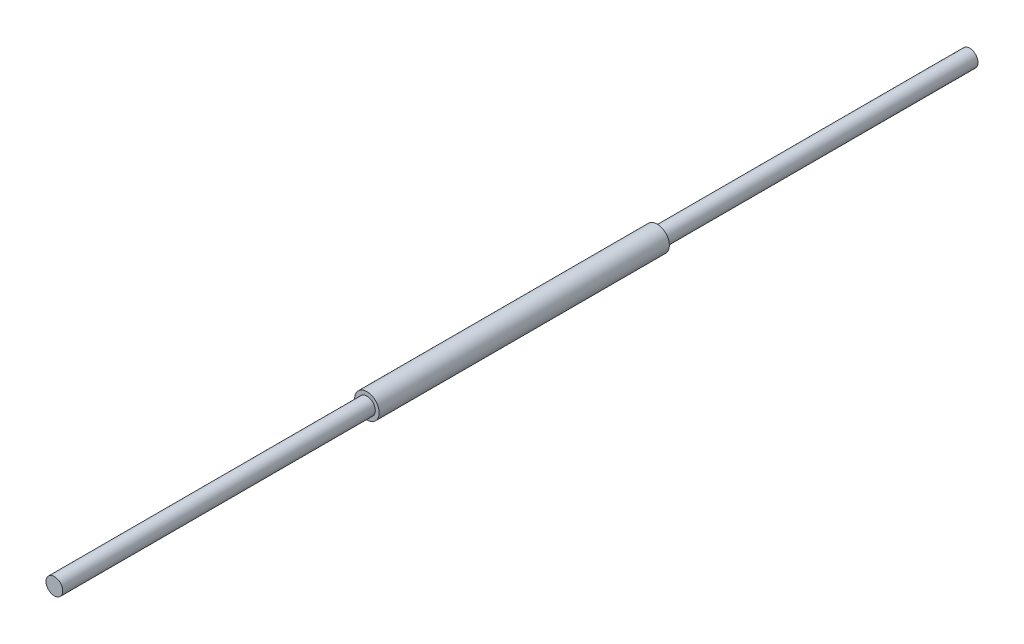
ISO-10303-21;
HEADER;
FILE_DESCRIPTION(('STEP AP214'),'2;1');
FILE_NAME('part.step','',(''),(''),'','','');
FILE_SCHEMA(('AUTOMOTIVE_DESIGN { 1 0 10303 214 1 1 1 1 }'));
ENDSEC;
DATA;
#1=APPLICATION_CONTEXT('core data for automotive mechanical design processes');
#2=APPLICATION_PROTOCOL_DEFINITION('international standard','automotive_design',2000,#1);
#3=PRODUCT_CONTEXT('',#1,'mechanical');
#4=PRODUCT('Part','Part','',(#3));
#5=PRODUCT_RELATED_PRODUCT_CATEGORY('part','',(#4));
#6=PRODUCT_DEFINITION_FORMATION('','',#4);
#7=PRODUCT_DEFINITION_CONTEXT('part definition',#1,'design');
#8=PRODUCT_DEFINITION('design','',#6,#7);
#9=PRODUCT_DEFINITION_SHAPE('','',#8);
#10=(LENGTH_UNIT() NAMED_UNIT(*) SI_UNIT(.MILLI.,.METRE.));
#11=(NAMED_UNIT(*) PLANE_ANGLE_UNIT() SI_UNIT($,.RADIAN.));
#12=(NAMED_UNIT(*) SI_UNIT($,.STERADIAN.) SOLID_ANGLE_UNIT());
#13=UNCERTAINTY_MEASURE_WITH_UNIT(LENGTH_MEASURE(1.E-05),#10,'distance_accuracy_value','');
#14=(GEOMETRIC_REPRESENTATION_CONTEXT(3) GLOBAL_UNCERTAINTY_ASSIGNED_CONTEXT((#13)) GLOBAL_UNIT_ASSIGNED_CONTEXT((#10,
#11,#12)) REPRESENTATION_CONTEXT('',''));
#15=CARTESIAN_POINT('',(0.,0.,0.));
#16=DIRECTION('',(0.,0.,1.));
#17=DIRECTION('',(1.,0.,0.));
#18=AXIS2_PLACEMENT_3D('',#15,#16,#17);
#19=CARTESIAN_POINT('',(0.,6.985,-82.55));
#20=DIRECTION('',(0.,0.,-1.));
#21=DIRECTION('',(-1.,0.,0.));
#22=AXIS2_PLACEMENT_3D('',#19,#20,#21);
#23=PLANE('',#22);
#24=CARTESIAN_POINT('',(0.,0.,-82.55));
#25=DIRECTION('',(0.,0.,-1.));
#26=DIRECTION('',(-1.,0.,0.));
#27=AXIS2_PLACEMENT_3D('',#24,#25,#26);
#28=CIRCLE('',#27,6.985);
#29=CARTESIAN_POINT('',(-6.985,0.,-82.55));
#30=VERTEX_POINT('',#29);
#31=EDGE_CURVE('E10',#30,#30,#28,.T.);
#32=ORIENTED_EDGE('',*,*,#31,.T.);
#33=EDGE_LOOP('',(#32));
#34=FACE_BOUND('',#33,.T.);
#35=CARTESIAN_POINT('',(0.,0.,-82.55));
#36=DIRECTION('',(0.,0.,-1.));
#37=DIRECTION('',(-1.,0.,0.));
#38=AXIS2_PLACEMENT_3D('',#35,#36,#37);
#39=CIRCLE('',#38,4.7625);
#40=CARTESIAN_POINT('',(-4.7625,0.,-82.55));
#41=VERTEX_POINT('',#40);
#42=EDGE_CURVE('E68',#41,#41,#39,.T.);
#43=ORIENTED_EDGE('',*,*,#42,.F.);
#44=EDGE_LOOP('',(#43));
#45=FACE_BOUND('',#44,.T.);
#46=ADVANCED_FACE('F41',(#34,#45),#23,.T.);
#47=CARTESIAN_POINT('',(0.,0.,-260.35));
#48=DIRECTION('',(0.,0.,-1.));
#49=DIRECTION('',(-1.,0.,0.));
#50=AXIS2_PLACEMENT_3D('',#47,#48,#49);
#51=CYLINDRICAL_SURFACE('',#50,6.985);
#52=CARTESIAN_POINT('',(0.,0.,82.5500000000001));
#53=DIRECTION('',(0.,0.,-1.));
#54=DIRECTION('',(-1.,0.,0.));
#55=AXIS2_PLACEMENT_3D('',#52,#53,#54);
#56=CIRCLE('',#55,6.985);
#57=CARTESIAN_POINT('',(-6.985,0.,82.5500000000001));
#58=VERTEX_POINT('',#57);
#59=EDGE_CURVE('E48',#58,#58,#56,.T.);
#60=ORIENTED_EDGE('',*,*,#59,.T.);
#61=EDGE_LOOP('',(#60));
#62=FACE_BOUND('',#61,.T.);
#63=ORIENTED_EDGE('',*,*,#31,.F.);
#64=EDGE_LOOP('',(#63));
#65=FACE_BOUND('',#64,.T.);
#66=ADVANCED_FACE('F77',(#62,#65),#51,.T.);
#67=CARTESIAN_POINT('',(0.,6.985,82.5500000000001));
#68=DIRECTION('',(0.,0.,1.));
#69=DIRECTION('',(1.,0.,0.));
#70=AXIS2_PLACEMENT_3D('',#67,#68,#69);
#71=PLANE('',#70);
#72=CARTESIAN_POINT('',(0.,0.,82.5500000000001));
#73=DIRECTION('',(0.,0.,-1.));
#74=DIRECTION('',(-1.,0.,0.));
#75=AXIS2_PLACEMENT_3D('',#72,#73,#74);
#76=CIRCLE('',#75,4.7625);
#77=CARTESIAN_POINT('',(-4.7625,0.,82.5500000000001));
#78=VERTEX_POINT('',#77);
#79=EDGE_CURVE('E53',#78,#78,#76,.T.);
#80=ORIENTED_EDGE('',*,*,#79,.T.);
#81=EDGE_LOOP('',(#80));
#82=FACE_BOUND('',#81,.T.);
#83=ORIENTED_EDGE('',*,*,#59,.F.);
#84=EDGE_LOOP('',(#83));
#85=FACE_BOUND('',#84,.T.);
#86=ADVANCED_FACE('F81',(#82,#85),#71,.T.);
#87=CARTESIAN_POINT('',(0.,0.,-260.35));
#88=DIRECTION('',(0.,0.,-1.));
#89=DIRECTION('',(-1.,0.,0.));
#90=AXIS2_PLACEMENT_3D('',#87,#88,#89);
#91=CYLINDRICAL_SURFACE('',#90,4.7625);
#92=CARTESIAN_POINT('',(0.,0.,260.35));
#93=DIRECTION('',(0.,0.,-1.));
#94=DIRECTION('',(-1.,0.,0.));
#95=AXIS2_PLACEMENT_3D('',#92,#93,#94);
#96=CIRCLE('',#95,4.7625);
#97=CARTESIAN_POINT('',(-4.7625,0.,260.35));
#98=VERTEX_POINT('',#97);
#99=EDGE_CURVE('E58',#98,#98,#96,.T.);
#100=ORIENTED_EDGE('',*,*,#99,.T.);
#101=EDGE_LOOP('',(#100));
#102=FACE_BOUND('',#101,.T.);
#103=ORIENTED_EDGE('',*,*,#79,.F.);
#104=EDGE_LOOP('',(#103));
#105=FACE_BOUND('',#104,.T.);
#106=ADVANCED_FACE('F85',(#102,#105),#91,.T.);
#107=CARTESIAN_POINT('',(0.,4.7625,260.35));
#108=DIRECTION('',(0.,0.,1.));
#109=DIRECTION('',(1.,0.,0.));
#110=AXIS2_PLACEMENT_3D('',#107,#108,#109);
#111=PLANE('',#110);
#112=ORIENTED_EDGE('',*,*,#99,.F.);
#113=EDGE_LOOP('',(#112));
#114=FACE_BOUND('',#113,.T.);
#115=ADVANCED_FACE('F92',(#114),#111,.T.);
#116=CARTESIAN_POINT('',(0.,4.7625,-260.35));
#117=DIRECTION('',(0.,0.,-1.));
#118=DIRECTION('',(-1.,0.,0.));
#119=AXIS2_PLACEMENT_3D('',#116,#117,#118);
#120=PLANE('',#119);
#121=CARTESIAN_POINT('',(0.,0.,-260.35));
#122=DIRECTION('',(0.,0.,-1.));
#123=DIRECTION('',(-1.,0.,0.));
#124=AXIS2_PLACEMENT_3D('',#121,#122,#123);
#125=CIRCLE('',#124,4.7625);
#126=CARTESIAN_POINT('',(-4.7625,0.,-260.35));
#127=VERTEX_POINT('',#126);
#128=EDGE_CURVE('E64',#127,#127,#125,.T.);
#129=ORIENTED_EDGE('',*,*,#128,.T.);
#130=EDGE_LOOP('',(#129));
#131=FACE_BOUND('',#130,.T.);
#132=ADVANCED_FACE('F96',(#131),#120,.T.);
#133=CARTESIAN_POINT('',(0.,0.,-260.35));
#134=DIRECTION('',(0.,0.,-1.));
#135=DIRECTION('',(-1.,0.,0.));
#136=AXIS2_PLACEMENT_3D('',#133,#134,#135);
#137=CYLINDRICAL_SURFACE('',#136,4.7625);
#138=ORIENTED_EDGE('',*,*,#42,.T.);
#139=EDGE_LOOP('',(#138));
#140=FACE_BOUND('',#139,.T.);
#141=ORIENTED_EDGE('',*,*,#128,.F.);
#142=EDGE_LOOP('',(#141));
#143=FACE_BOUND('',#142,.T.);
#144=ADVANCED_FACE('F73',(#140,#143),#137,.T.);
#145=CLOSED_SHELL('',(#46,#66,#86,#106,#115,#132,#144));
#146=MANIFOLD_SOLID_BREP('B2',#145);
#147=ADVANCED_BREP_SHAPE_REPRESENTATION('',(#18,#146),#14);
#148=SHAPE_DEFINITION_REPRESENTATION(#9,#147);
ENDSEC;
END-ISO-10303-21;
